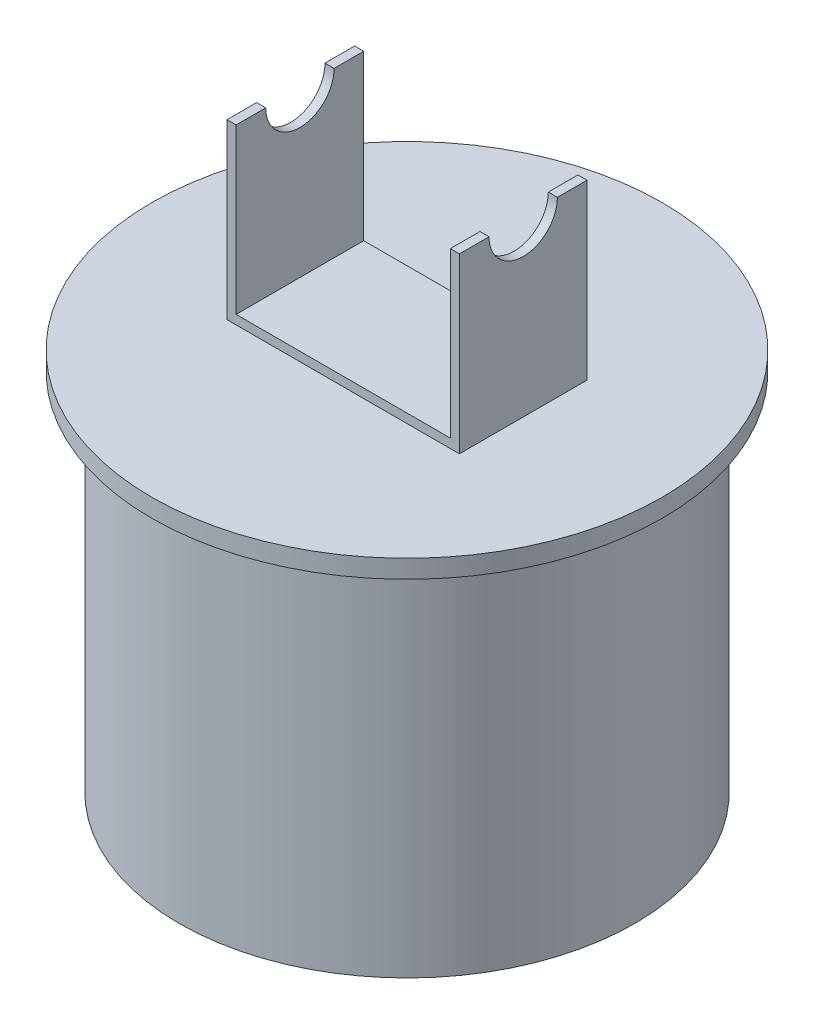
ISO-10303-21;
HEADER;
FILE_DESCRIPTION(('STEP AP214'),'2;1');
FILE_NAME('part.step','',(''),(''),'','','');
FILE_SCHEMA(('AUTOMOTIVE_DESIGN { 1 0 10303 214 1 1 1 1 }'));
ENDSEC;
DATA;
#1=APPLICATION_CONTEXT('core data for automotive mechanical design processes');
#2=APPLICATION_PROTOCOL_DEFINITION('international standard','automotive_design',2000,#1);
#3=PRODUCT_CONTEXT('',#1,'mechanical');
#4=PRODUCT('Part','Part','',(#3));
#5=PRODUCT_RELATED_PRODUCT_CATEGORY('part','',(#4));
#6=PRODUCT_DEFINITION_FORMATION('','',#4);
#7=PRODUCT_DEFINITION_CONTEXT('part definition',#1,'design');
#8=PRODUCT_DEFINITION('design','',#6,#7);
#9=PRODUCT_DEFINITION_SHAPE('','',#8);
#10=(LENGTH_UNIT() NAMED_UNIT(*) SI_UNIT(.MILLI.,.METRE.));
#11=(NAMED_UNIT(*) PLANE_ANGLE_UNIT() SI_UNIT($,.RADIAN.));
#12=(NAMED_UNIT(*) SI_UNIT($,.STERADIAN.) SOLID_ANGLE_UNIT());
#13=UNCERTAINTY_MEASURE_WITH_UNIT(LENGTH_MEASURE(1.E-05),#10,'distance_accuracy_value','');
#14=(GEOMETRIC_REPRESENTATION_CONTEXT(3) GLOBAL_UNCERTAINTY_ASSIGNED_CONTEXT((#13)) GLOBAL_UNIT_ASSIGNED_CONTEXT((#10,
#11,#12)) REPRESENTATION_CONTEXT('',''));
#15=CARTESIAN_POINT('',(0.,0.,0.));
#16=DIRECTION('',(0.,0.,1.));
#17=DIRECTION('',(1.,0.,0.));
#18=AXIS2_PLACEMENT_3D('',#15,#16,#17);
#19=CARTESIAN_POINT('',(0.,42.,0.));
#20=DIRECTION('',(0.,1.,0.));
#21=DIRECTION('',(0.,0.,1.));
#22=AXIS2_PLACEMENT_3D('',#19,#20,#21);
#23=PLANE('',#22);
#24=DIRECTION('',(1.,0.,0.));
#25=VECTOR('',#24,1.);
#26=CARTESIAN_POINT('',(-25.5,42.,7.5));
#27=LINE('',#26,#25);
#28=CARTESIAN_POINT('',(23.5,42.,7.5));
#29=VERTEX_POINT('',#28);
#30=CARTESIAN_POINT('',(25.5,42.,7.5));
#31=VERTEX_POINT('',#30);
#32=EDGE_CURVE('E375',#29,#31,#27,.T.);
#33=ORIENTED_EDGE('',*,*,#32,.F.);
#34=DIRECTION('',(0.,0.,-1.));
#35=VECTOR('',#34,1.);
#36=CARTESIAN_POINT('',(23.5,42.,-14.));
#37=LINE('',#36,#35);
#38=CARTESIAN_POINT('',(23.5,42.,14.));
#39=VERTEX_POINT('',#38);
#40=EDGE_CURVE('E349',#39,#29,#37,.T.);
#41=ORIENTED_EDGE('',*,*,#40,.F.);
#42=DIRECTION('',(1.,0.,0.));
#43=VECTOR('',#42,1.);
#44=CARTESIAN_POINT('',(-25.5,42.,14.));
#45=LINE('',#44,#43);
#46=CARTESIAN_POINT('',(25.5,42.,14.));
#47=VERTEX_POINT('',#46);
#48=EDGE_CURVE('E145',#39,#47,#45,.T.);
#49=ORIENTED_EDGE('',*,*,#48,.T.);
#50=DIRECTION('',(0.,0.,-1.));
#51=VECTOR('',#50,1.);
#52=CARTESIAN_POINT('',(25.5,42.,-14.));
#53=LINE('',#52,#51);
#54=EDGE_CURVE('E360',#47,#31,#53,.T.);
#55=ORIENTED_EDGE('',*,*,#54,.T.);
#56=EDGE_LOOP('',(#33,#41,#49,#55));
#57=FACE_BOUND('',#56,.T.);
#58=ADVANCED_FACE('F36',(#57),#23,.T.);
#59=DIRECTION('',(1.,0.,0.));
#60=VECTOR('',#59,1.);
#61=CARTESIAN_POINT('',(-25.5,42.,7.5));
#62=LINE('',#61,#60);
#63=CARTESIAN_POINT('',(-25.5,42.,7.5));
#64=VERTEX_POINT('',#63);
#65=CARTESIAN_POINT('',(-23.5,42.,7.5));
#66=VERTEX_POINT('',#65);
#67=EDGE_CURVE('E59',#64,#66,#62,.T.);
#68=ORIENTED_EDGE('',*,*,#67,.F.);
#69=DIRECTION('',(0.,0.,1.));
#70=VECTOR('',#69,1.);
#71=CARTESIAN_POINT('',(-25.5,42.,-14.));
#72=LINE('',#71,#70);
#73=CARTESIAN_POINT('',(-25.5,42.,14.));
#74=VERTEX_POINT('',#73);
#75=EDGE_CURVE('E138',#64,#74,#72,.T.);
#76=ORIENTED_EDGE('',*,*,#75,.T.);
#77=CARTESIAN_POINT('',(-23.5,42.,14.));
#78=VERTEX_POINT('',#77);
#79=EDGE_CURVE('E147',#74,#78,#45,.T.);
#80=ORIENTED_EDGE('',*,*,#79,.T.);
#81=DIRECTION('',(0.,0.,1.));
#82=VECTOR('',#81,1.);
#83=CARTESIAN_POINT('',(-23.5,42.,-14.));
#84=LINE('',#83,#82);
#85=EDGE_CURVE('E352',#66,#78,#84,.T.);
#86=ORIENTED_EDGE('',*,*,#85,.F.);
#87=EDGE_LOOP('',(#68,#76,#80,#86));
#88=FACE_BOUND('',#87,.T.);
#89=ADVANCED_FACE('F203',(#88),#23,.T.);
#90=DIRECTION('',(1.,0.,0.));
#91=VECTOR('',#90,1.);
#92=CARTESIAN_POINT('',(-25.5,42.,-7.5));
#93=LINE('',#92,#91);
#94=CARTESIAN_POINT('',(25.5,42.,-7.5));
#95=VERTEX_POINT('',#94);
#96=CARTESIAN_POINT('',(23.5,42.,-7.5));
#97=VERTEX_POINT('',#96);
#98=EDGE_CURVE('E51',#95,#97,#93,.F.);
#99=ORIENTED_EDGE('',*,*,#98,.F.);
#100=CARTESIAN_POINT('',(25.5,42.,-14.));
#101=VERTEX_POINT('',#100);
#102=EDGE_CURVE('E168',#95,#101,#53,.T.);
#103=ORIENTED_EDGE('',*,*,#102,.T.);
#104=DIRECTION('',(-1.,0.,0.));
#105=VECTOR('',#104,1.);
#106=CARTESIAN_POINT('',(-25.5,42.,-14.));
#107=LINE('',#106,#105);
#108=CARTESIAN_POINT('',(23.5,42.,-14.));
#109=VERTEX_POINT('',#108);
#110=EDGE_CURVE('E149',#101,#109,#107,.T.);
#111=ORIENTED_EDGE('',*,*,#110,.T.);
#112=EDGE_CURVE('E353',#97,#109,#37,.T.);
#113=ORIENTED_EDGE('',*,*,#112,.F.);
#114=EDGE_LOOP('',(#99,#103,#111,#113));
#115=FACE_BOUND('',#114,.T.);
#116=ADVANCED_FACE('F195',(#115),#23,.T.);
#117=CARTESIAN_POINT('',(0.,-80.,0.));
#118=DIRECTION('',(0.,1.,0.));
#119=DIRECTION('',(0.,0.,1.));
#120=AXIS2_PLACEMENT_3D('',#117,#118,#119);
#121=CYLINDRICAL_SURFACE('',#120,50.);
#122=CARTESIAN_POINT('',(0.,-80.,0.));
#123=DIRECTION('',(0.,1.,0.));
#124=DIRECTION('',(0.,0.,1.));
#125=AXIS2_PLACEMENT_3D('',#122,#123,#124);
#126=CIRCLE('',#125,50.);
#127=CARTESIAN_POINT('',(0.,-80.,50.));
#128=VERTEX_POINT('',#127);
#129=EDGE_CURVE('E44',#128,#128,#126,.T.);
#130=ORIENTED_EDGE('',*,*,#129,.T.);
#131=EDGE_LOOP('',(#130));
#132=FACE_BOUND('',#131,.T.);
#133=CARTESIAN_POINT('',(0.,0.,0.));
#134=DIRECTION('',(0.,1.,0.));
#135=DIRECTION('',(0.,0.,1.));
#136=AXIS2_PLACEMENT_3D('',#133,#134,#135);
#137=CIRCLE('',#136,50.);
#138=CARTESIAN_POINT('',(0.,0.,50.));
#139=VERTEX_POINT('',#138);
#140=EDGE_CURVE('E183',#139,#139,#137,.T.);
#141=ORIENTED_EDGE('',*,*,#140,.F.);
#142=EDGE_LOOP('',(#141));
#143=FACE_BOUND('',#142,.T.);
#144=ADVANCED_FACE('F38',(#132,#143),#121,.T.);
#145=CARTESIAN_POINT('',(0.,-80.,0.));
#146=DIRECTION('',(0.,1.,0.));
#147=DIRECTION('',(0.,0.,1.));
#148=AXIS2_PLACEMENT_3D('',#145,#146,#147);
#149=PLANE('',#148);
#150=ORIENTED_EDGE('',*,*,#129,.F.);
#151=EDGE_LOOP('',(#150));
#152=FACE_BOUND('',#151,.T.);
#153=ADVANCED_FACE('F194',(#152),#149,.F.);
#154=CARTESIAN_POINT('',(0.,4.,0.));
#155=DIRECTION('',(0.,-1.,0.));
#156=DIRECTION('',(0.,0.,-1.));
#157=AXIS2_PLACEMENT_3D('',#154,#155,#156);
#158=CYLINDRICAL_SURFACE('',#157,56.);
#159=CARTESIAN_POINT('',(0.,4.,0.));
#160=DIRECTION('',(0.,1.,0.));
#161=DIRECTION('',(0.,0.,1.));
#162=AXIS2_PLACEMENT_3D('',#159,#160,#161);
#163=CIRCLE('',#162,56.);
#164=CARTESIAN_POINT('',(0.,4.,56.));
#165=VERTEX_POINT('',#164);
#166=EDGE_CURVE('E180',#165,#165,#163,.T.);
#167=ORIENTED_EDGE('',*,*,#166,.F.);
#168=EDGE_LOOP('',(#167));
#169=FACE_BOUND('',#168,.T.);
#170=CARTESIAN_POINT('',(0.,0.,0.));
#171=DIRECTION('',(0.,1.,0.));
#172=DIRECTION('',(0.,0.,1.));
#173=AXIS2_PLACEMENT_3D('',#170,#171,#172);
#174=CIRCLE('',#173,56.);
#175=CARTESIAN_POINT('',(0.,0.,56.));
#176=VERTEX_POINT('',#175);
#177=EDGE_CURVE('E179',#176,#176,#174,.T.);
#178=ORIENTED_EDGE('',*,*,#177,.T.);
#179=EDGE_LOOP('',(#178));
#180=FACE_BOUND('',#179,.T.);
#181=ADVANCED_FACE('F201',(#169,#180),#158,.T.);
#182=CARTESIAN_POINT('',(0.,4.,0.));
#183=DIRECTION('',(0.,1.,0.));
#184=DIRECTION('',(0.,0.,1.));
#185=AXIS2_PLACEMENT_3D('',#182,#183,#184);
#186=PLANE('',#185);
#187=DIRECTION('',(0.,0.,-1.));
#188=VECTOR('',#187,1.);
#189=CARTESIAN_POINT('',(25.5,4.,-14.));
#190=LINE('',#189,#188);
#191=CARTESIAN_POINT('',(25.5,4.,14.));
#192=VERTEX_POINT('',#191);
#193=CARTESIAN_POINT('',(25.5,4.,-14.));
#194=VERTEX_POINT('',#193);
#195=EDGE_CURVE('E155',#192,#194,#190,.T.);
#196=ORIENTED_EDGE('',*,*,#195,.F.);
#197=DIRECTION('',(1.,0.,0.));
#198=VECTOR('',#197,1.);
#199=CARTESIAN_POINT('',(-25.5,4.,14.));
#200=LINE('',#199,#198);
#201=CARTESIAN_POINT('',(-25.5,4.,14.));
#202=VERTEX_POINT('',#201);
#203=EDGE_CURVE('E165',#202,#192,#200,.T.);
#204=ORIENTED_EDGE('',*,*,#203,.F.);
#205=DIRECTION('',(0.,0.,1.));
#206=VECTOR('',#205,1.);
#207=CARTESIAN_POINT('',(-25.5,4.,-14.));
#208=LINE('',#207,#206);
#209=CARTESIAN_POINT('',(-25.5,4.,-14.));
#210=VERTEX_POINT('',#209);
#211=EDGE_CURVE('E162',#210,#202,#208,.T.);
#212=ORIENTED_EDGE('',*,*,#211,.F.);
#213=DIRECTION('',(-1.,0.,0.));
#214=VECTOR('',#213,1.);
#215=CARTESIAN_POINT('',(-25.5,4.,-14.));
#216=LINE('',#215,#214);
#217=EDGE_CURVE('E158',#194,#210,#216,.T.);
#218=ORIENTED_EDGE('',*,*,#217,.F.);
#219=EDGE_LOOP('',(#196,#204,#212,#218));
#220=FACE_BOUND('',#219,.T.);
#221=ORIENTED_EDGE('',*,*,#166,.T.);
#222=EDGE_LOOP('',(#221));
#223=FACE_BOUND('',#222,.T.);
#224=ADVANCED_FACE('F239',(#220,#223),#186,.T.);
#225=CARTESIAN_POINT('',(0.,0.,0.));
#226=DIRECTION('',(0.,1.,0.));
#227=DIRECTION('',(0.,0.,1.));
#228=AXIS2_PLACEMENT_3D('',#225,#226,#227);
#229=PLANE('',#228);
#230=ORIENTED_EDGE('',*,*,#140,.T.);
#231=EDGE_LOOP('',(#230));
#232=FACE_BOUND('',#231,.T.);
#233=ORIENTED_EDGE('',*,*,#177,.F.);
#234=EDGE_LOOP('',(#233));
#235=FACE_BOUND('',#234,.T.);
#236=ADVANCED_FACE('F190',(#232,#235),#229,.F.);
#237=CARTESIAN_POINT('',(25.5,42.,-14.));
#238=DIRECTION('',(-1.,0.,0.));
#239=DIRECTION('',(0.,0.,1.));
#240=AXIS2_PLACEMENT_3D('',#237,#238,#239);
#241=PLANE('',#240);
#242=ORIENTED_EDGE('',*,*,#102,.F.);
#243=CARTESIAN_POINT('',(25.5,42.,0.));
#244=DIRECTION('',(1.,0.,0.));
#245=DIRECTION('',(0.,0.,-1.));
#246=AXIS2_PLACEMENT_3D('',#243,#244,#245);
#247=CIRCLE('',#246,7.5);
#248=EDGE_CURVE('E139',#31,#95,#247,.T.);
#249=ORIENTED_EDGE('',*,*,#248,.F.);
#250=ORIENTED_EDGE('',*,*,#54,.F.);
#251=DIRECTION('',(0.,-1.,0.));
#252=VECTOR('',#251,1.);
#253=CARTESIAN_POINT('',(25.5,42.,14.));
#254=LINE('',#253,#252);
#255=EDGE_CURVE('E154',#47,#192,#254,.T.);
#256=ORIENTED_EDGE('',*,*,#255,.T.);
#257=ORIENTED_EDGE('',*,*,#195,.T.);
#258=DIRECTION('',(0.,-1.,0.));
#259=VECTOR('',#258,1.);
#260=CARTESIAN_POINT('',(25.5,42.,-14.));
#261=LINE('',#260,#259);
#262=EDGE_CURVE('E176',#101,#194,#261,.T.);
#263=ORIENTED_EDGE('',*,*,#262,.F.);
#264=EDGE_LOOP('',(#242,#249,#250,#256,#257,#263));
#265=FACE_BOUND('',#264,.T.);
#266=ADVANCED_FACE('F234',(#265),#241,.F.);
#267=CARTESIAN_POINT('',(-25.5,42.,-14.));
#268=DIRECTION('',(0.,0.,1.));
#269=DIRECTION('',(1.,0.,0.));
#270=AXIS2_PLACEMENT_3D('',#267,#268,#269);
#271=PLANE('',#270);
#272=DIRECTION('',(-1.,0.,0.));
#273=VECTOR('',#272,1.);
#274=CARTESIAN_POINT('',(-23.5,6.,-14.));
#275=LINE('',#274,#273);
#276=CARTESIAN_POINT('',(23.5,6.,-14.));
#277=VERTEX_POINT('',#276);
#278=CARTESIAN_POINT('',(-23.5,6.,-14.));
#279=VERTEX_POINT('',#278);
#280=EDGE_CURVE('E331',#277,#279,#275,.T.);
#281=ORIENTED_EDGE('',*,*,#280,.F.);
#282=DIRECTION('',(0.,1.,0.));
#283=VECTOR('',#282,1.);
#284=CARTESIAN_POINT('',(23.5,6.,-14.));
#285=LINE('',#284,#283);
#286=EDGE_CURVE('E340',#277,#109,#285,.T.);
#287=ORIENTED_EDGE('',*,*,#286,.T.);
#288=ORIENTED_EDGE('',*,*,#110,.F.);
#289=ORIENTED_EDGE('',*,*,#262,.T.);
#290=ORIENTED_EDGE('',*,*,#217,.T.);
#291=DIRECTION('',(0.,-1.,0.));
#292=VECTOR('',#291,1.);
#293=CARTESIAN_POINT('',(-25.5,42.,-14.));
#294=LINE('',#293,#292);
#295=CARTESIAN_POINT('',(-25.5,42.,-14.));
#296=VERTEX_POINT('',#295);
#297=EDGE_CURVE('E174',#296,#210,#294,.T.);
#298=ORIENTED_EDGE('',*,*,#297,.F.);
#299=CARTESIAN_POINT('',(-23.5,42.,-14.));
#300=VERTEX_POINT('',#299);
#301=EDGE_CURVE('E143',#300,#296,#107,.T.);
#302=ORIENTED_EDGE('',*,*,#301,.F.);
#303=DIRECTION('',(0.,1.,0.));
#304=VECTOR('',#303,1.);
#305=CARTESIAN_POINT('',(-23.5,6.,-14.));
#306=LINE('',#305,#304);
#307=EDGE_CURVE('E342',#279,#300,#306,.T.);
#308=ORIENTED_EDGE('',*,*,#307,.F.);
#309=EDGE_LOOP('',(#281,#287,#288,#289,#290,#298,#302,#308));
#310=FACE_BOUND('',#309,.T.);
#311=ADVANCED_FACE('F228',(#310),#271,.F.);
#312=CARTESIAN_POINT('',(-25.5,42.,-14.));
#313=DIRECTION('',(1.,0.,0.));
#314=DIRECTION('',(0.,0.,-1.));
#315=AXIS2_PLACEMENT_3D('',#312,#313,#314);
#316=PLANE('',#315);
#317=ORIENTED_EDGE('',*,*,#75,.F.);
#318=CARTESIAN_POINT('',(-25.5,42.,0.));
#319=DIRECTION('',(1.,0.,0.));
#320=DIRECTION('',(0.,0.,-1.));
#321=AXIS2_PLACEMENT_3D('',#318,#319,#320);
#322=CIRCLE('',#321,7.5);
#323=CARTESIAN_POINT('',(-25.5,42.,-7.5));
#324=VERTEX_POINT('',#323);
#325=EDGE_CURVE('E125',#64,#324,#322,.T.);
#326=ORIENTED_EDGE('',*,*,#325,.T.);
#327=EDGE_CURVE('E136',#296,#324,#72,.T.);
#328=ORIENTED_EDGE('',*,*,#327,.F.);
#329=ORIENTED_EDGE('',*,*,#297,.T.);
#330=ORIENTED_EDGE('',*,*,#211,.T.);
#331=DIRECTION('',(0.,-1.,0.));
#332=VECTOR('',#331,1.);
#333=CARTESIAN_POINT('',(-25.5,42.,14.));
#334=LINE('',#333,#332);
#335=EDGE_CURVE('E171',#74,#202,#334,.T.);
#336=ORIENTED_EDGE('',*,*,#335,.F.);
#337=EDGE_LOOP('',(#317,#326,#328,#329,#330,#336));
#338=FACE_BOUND('',#337,.T.);
#339=ADVANCED_FACE('F134',(#338),#316,.F.);
#340=CARTESIAN_POINT('',(-25.5,42.,14.));
#341=DIRECTION('',(0.,0.,-1.));
#342=DIRECTION('',(-1.,0.,0.));
#343=AXIS2_PLACEMENT_3D('',#340,#341,#342);
#344=PLANE('',#343);
#345=ORIENTED_EDGE('',*,*,#48,.F.);
#346=DIRECTION('',(0.,1.,0.));
#347=VECTOR('',#346,1.);
#348=CARTESIAN_POINT('',(23.5,6.,14.));
#349=LINE('',#348,#347);
#350=CARTESIAN_POINT('',(23.5,6.,14.));
#351=VERTEX_POINT('',#350);
#352=EDGE_CURVE('E159',#351,#39,#349,.T.);
#353=ORIENTED_EDGE('',*,*,#352,.F.);
#354=DIRECTION('',(1.,0.,0.));
#355=VECTOR('',#354,1.);
#356=CARTESIAN_POINT('',(-23.5,6.,14.));
#357=LINE('',#356,#355);
#358=CARTESIAN_POINT('',(-23.5,6.,14.));
#359=VERTEX_POINT('',#358);
#360=EDGE_CURVE('E334',#359,#351,#357,.T.);
#361=ORIENTED_EDGE('',*,*,#360,.F.);
#362=DIRECTION('',(0.,1.,0.));
#363=VECTOR('',#362,1.);
#364=CARTESIAN_POINT('',(-23.5,6.,14.));
#365=LINE('',#364,#363);
#366=EDGE_CURVE('E356',#359,#78,#365,.T.);
#367=ORIENTED_EDGE('',*,*,#366,.T.);
#368=ORIENTED_EDGE('',*,*,#79,.F.);
#369=ORIENTED_EDGE('',*,*,#335,.T.);
#370=ORIENTED_EDGE('',*,*,#203,.T.);
#371=ORIENTED_EDGE('',*,*,#255,.F.);
#372=EDGE_LOOP('',(#345,#353,#361,#367,#368,#369,#370,#371));
#373=FACE_BOUND('',#372,.T.);
#374=ADVANCED_FACE('F217',(#373),#344,.F.);
#375=DIRECTION('',(1.,0.,0.));
#376=VECTOR('',#375,1.);
#377=CARTESIAN_POINT('',(-25.5,42.,-7.5));
#378=LINE('',#377,#376);
#379=CARTESIAN_POINT('',(-23.5,42.,-7.5));
#380=VERTEX_POINT('',#379);
#381=EDGE_CURVE('E122',#380,#324,#378,.F.);
#382=ORIENTED_EDGE('',*,*,#381,.F.);
#383=EDGE_CURVE('E336',#300,#380,#84,.T.);
#384=ORIENTED_EDGE('',*,*,#383,.F.);
#385=ORIENTED_EDGE('',*,*,#301,.T.);
#386=ORIENTED_EDGE('',*,*,#327,.T.);
#387=EDGE_LOOP('',(#382,#384,#385,#386));
#388=FACE_BOUND('',#387,.T.);
#389=ADVANCED_FACE('F141',(#388),#23,.T.);
#390=CARTESIAN_POINT('',(23.5,6.,-14.));
#391=DIRECTION('',(1.,0.,0.));
#392=DIRECTION('',(0.,0.,-1.));
#393=AXIS2_PLACEMENT_3D('',#390,#391,#392);
#394=PLANE('',#393);
#395=ORIENTED_EDGE('',*,*,#40,.T.);
#396=CARTESIAN_POINT('',(23.5,42.,0.));
#397=DIRECTION('',(1.,0.,0.));
#398=DIRECTION('',(0.,0.,-1.));
#399=AXIS2_PLACEMENT_3D('',#396,#397,#398);
#400=CIRCLE('',#399,7.5);
#401=EDGE_CURVE('E370',#29,#97,#400,.T.);
#402=ORIENTED_EDGE('',*,*,#401,.T.);
#403=ORIENTED_EDGE('',*,*,#112,.T.);
#404=ORIENTED_EDGE('',*,*,#286,.F.);
#405=DIRECTION('',(0.,0.,-1.));
#406=VECTOR('',#405,1.);
#407=CARTESIAN_POINT('',(23.5,6.,-14.));
#408=LINE('',#407,#406);
#409=EDGE_CURVE('E328',#351,#277,#408,.T.);
#410=ORIENTED_EDGE('',*,*,#409,.F.);
#411=ORIENTED_EDGE('',*,*,#352,.T.);
#412=EDGE_LOOP('',(#395,#402,#403,#404,#410,#411));
#413=FACE_BOUND('',#412,.T.);
#414=ADVANCED_FACE('F216',(#413),#394,.F.);
#415=CARTESIAN_POINT('',(-23.5,6.,-14.));
#416=DIRECTION('',(-1.,0.,0.));
#417=DIRECTION('',(0.,0.,1.));
#418=AXIS2_PLACEMENT_3D('',#415,#416,#417);
#419=PLANE('',#418);
#420=ORIENTED_EDGE('',*,*,#383,.T.);
#421=CARTESIAN_POINT('',(-23.5,42.,0.));
#422=DIRECTION('',(-1.,0.,0.));
#423=DIRECTION('',(0.,0.,1.));
#424=AXIS2_PLACEMENT_3D('',#421,#422,#423);
#425=CIRCLE('',#424,7.5);
#426=EDGE_CURVE('E11',#380,#66,#425,.T.);
#427=ORIENTED_EDGE('',*,*,#426,.T.);
#428=ORIENTED_EDGE('',*,*,#85,.T.);
#429=ORIENTED_EDGE('',*,*,#366,.F.);
#430=DIRECTION('',(0.,0.,1.));
#431=VECTOR('',#430,1.);
#432=CARTESIAN_POINT('',(-23.5,6.,-14.));
#433=LINE('',#432,#431);
#434=EDGE_CURVE('E343',#279,#359,#433,.T.);
#435=ORIENTED_EDGE('',*,*,#434,.F.);
#436=ORIENTED_EDGE('',*,*,#307,.T.);
#437=EDGE_LOOP('',(#420,#427,#428,#429,#435,#436));
#438=FACE_BOUND('',#437,.T.);
#439=ADVANCED_FACE('F222',(#438),#419,.F.);
#440=CARTESIAN_POINT('',(0.,6.,0.));
#441=DIRECTION('',(0.,1.,0.));
#442=DIRECTION('',(0.,0.,1.));
#443=AXIS2_PLACEMENT_3D('',#440,#441,#442);
#444=PLANE('',#443);
#445=ORIENTED_EDGE('',*,*,#409,.T.);
#446=ORIENTED_EDGE('',*,*,#280,.T.);
#447=ORIENTED_EDGE('',*,*,#434,.T.);
#448=ORIENTED_EDGE('',*,*,#360,.T.);
#449=EDGE_LOOP('',(#445,#446,#447,#448));
#450=FACE_BOUND('',#449,.T.);
#451=ADVANCED_FACE('F297',(#450),#444,.T.);
#452=CARTESIAN_POINT('',(-25.5,42.,0.));
#453=DIRECTION('',(1.,0.,0.));
#454=DIRECTION('',(0.,0.,-1.));
#455=AXIS2_PLACEMENT_3D('',#452,#453,#454);
#456=CYLINDRICAL_SURFACE('',#455,7.5);
#457=ORIENTED_EDGE('',*,*,#67,.T.);
#458=ORIENTED_EDGE('',*,*,#426,.F.);
#459=ORIENTED_EDGE('',*,*,#381,.T.);
#460=ORIENTED_EDGE('',*,*,#325,.F.);
#461=EDGE_LOOP('',(#457,#458,#459,#460));
#462=FACE_BOUND('',#461,.T.);
#463=ADVANCED_FACE('F124',(#462),#456,.F.);
#464=ORIENTED_EDGE('',*,*,#32,.T.);
#465=ORIENTED_EDGE('',*,*,#248,.T.);
#466=ORIENTED_EDGE('',*,*,#98,.T.);
#467=ORIENTED_EDGE('',*,*,#401,.F.);
#468=EDGE_LOOP('',(#464,#465,#466,#467));
#469=FACE_BOUND('',#468,.T.);
#470=ADVANCED_FACE('F309',(#469),#456,.F.);
#471=CLOSED_SHELL('',(#58,#89,#116,#144,#153,#181,#224,#236,#266,#311,#339,#374,#389,#414,#439,
#451,#463,#470));
#472=MANIFOLD_SOLID_BREP('B2',#471);
#473=ADVANCED_BREP_SHAPE_REPRESENTATION('',(#18,#472),#14);
#474=SHAPE_DEFINITION_REPRESENTATION(#9,#473);
ENDSEC;
END-ISO-10303-21;
